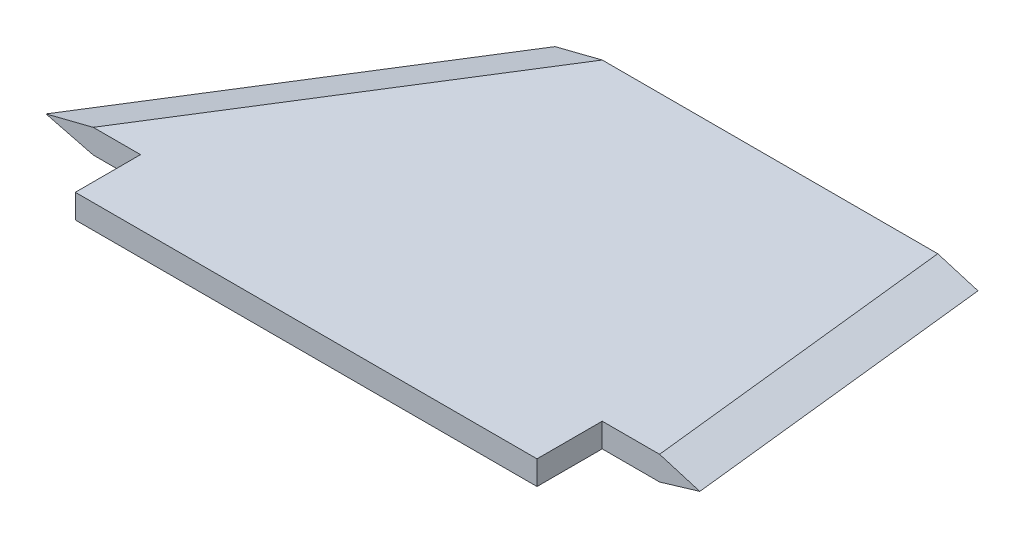
ISO-10303-21;
HEADER;
FILE_DESCRIPTION(('STEP AP214'),'2;1');
FILE_NAME('part.step','',(''),(''),'','','');
FILE_SCHEMA(('AUTOMOTIVE_DESIGN { 1 0 10303 214 1 1 1 1 }'));
ENDSEC;
DATA;
#1=APPLICATION_CONTEXT('core data for automotive mechanical design processes');
#2=APPLICATION_PROTOCOL_DEFINITION('international standard','automotive_design',2000,#1);
#3=PRODUCT_CONTEXT('',#1,'mechanical');
#4=PRODUCT('Part','Part','',(#3));
#5=PRODUCT_RELATED_PRODUCT_CATEGORY('part','',(#4));
#6=PRODUCT_DEFINITION_FORMATION('','',#4);
#7=PRODUCT_DEFINITION_CONTEXT('part definition',#1,'design');
#8=PRODUCT_DEFINITION('design','',#6,#7);
#9=PRODUCT_DEFINITION_SHAPE('','',#8);
#10=(LENGTH_UNIT() NAMED_UNIT(*) SI_UNIT(.MILLI.,.METRE.));
#11=(NAMED_UNIT(*) PLANE_ANGLE_UNIT() SI_UNIT($,.RADIAN.));
#12=(NAMED_UNIT(*) SI_UNIT($,.STERADIAN.) SOLID_ANGLE_UNIT());
#13=UNCERTAINTY_MEASURE_WITH_UNIT(LENGTH_MEASURE(1.E-05),#10,'distance_accuracy_value','');
#14=(GEOMETRIC_REPRESENTATION_CONTEXT(3) GLOBAL_UNCERTAINTY_ASSIGNED_CONTEXT((#13)) GLOBAL_UNIT_ASSIGNED_CONTEXT((#10,
#11,#12)) REPRESENTATION_CONTEXT('',''));
#15=CARTESIAN_POINT('',(0.,0.,0.));
#16=DIRECTION('',(0.,0.,1.));
#17=DIRECTION('',(1.,0.,0.));
#18=AXIS2_PLACEMENT_3D('',#15,#16,#17);
#19=CARTESIAN_POINT('',(0.,5.2832,0.));
#20=DIRECTION('',(0.,0.,-1.));
#21=DIRECTION('',(-1.,0.,0.));
#22=AXIS2_PLACEMENT_3D('',#19,#20,#21);
#23=PLANE('',#22);
#24=DIRECTION('',(-0.969192033309641,-0.246306318573284,0.));
#25=VECTOR('',#24,1.);
#26=CARTESIAN_POINT('',(11.0152498630052,4.27256849321468,0.));
#27=LINE('',#26,#25);
#28=CARTESIAN_POINT('',(14.9919891146075,5.2832,0.));
#29=VERTEX_POINT('',#28);
#30=CARTESIAN_POINT('',(4.59754332847974,2.64160000000002,0.));
#31=VERTEX_POINT('',#30);
#32=EDGE_CURVE('E159',#29,#31,#27,.T.);
#33=ORIENTED_EDGE('',*,*,#32,.T.);
#34=DIRECTION('',(-0.969192033309639,0.246306318573292,0.));
#35=VECTOR('',#34,1.);
#36=CARTESIAN_POINT('',(40.560407465065,-6.49784849565622,0.));
#37=LINE('',#36,#35);
#38=CARTESIAN_POINT('',(14.9919891146074,0.,0.));
#39=VERTEX_POINT('',#38);
#40=EDGE_CURVE('E167',#31,#39,#37,.F.);
#41=ORIENTED_EDGE('',*,*,#40,.T.);
#42=DIRECTION('',(1.,0.,0.));
#43=VECTOR('',#42,1.);
#44=CARTESIAN_POINT('',(0.,0.,0.));
#45=LINE('',#44,#43);
#46=CARTESIAN_POINT('',(25.4,0.,0.));
#47=VERTEX_POINT('',#46);
#48=EDGE_CURVE('E145',#39,#47,#45,.T.);
#49=ORIENTED_EDGE('',*,*,#48,.T.);
#50=DIRECTION('',(0.,-1.,0.));
#51=VECTOR('',#50,1.);
#52=CARTESIAN_POINT('',(25.4,5.2832,0.));
#53=LINE('',#52,#51);
#54=CARTESIAN_POINT('',(25.4,5.2832,0.));
#55=VERTEX_POINT('',#54);
#56=EDGE_CURVE('E136',#55,#47,#53,.T.);
#57=ORIENTED_EDGE('',*,*,#56,.F.);
#58=DIRECTION('',(1.,0.,0.));
#59=VECTOR('',#58,1.);
#60=CARTESIAN_POINT('',(0.,5.2832,0.));
#61=LINE('',#60,#59);
#62=EDGE_CURVE('E118',#29,#55,#61,.T.);
#63=ORIENTED_EDGE('',*,*,#62,.F.);
#64=EDGE_LOOP('',(#33,#41,#49,#57,#63));
#65=FACE_BOUND('',#64,.T.);
#66=ADVANCED_FACE('F41',(#65),#23,.F.);
#67=DIRECTION('',(-0.958305370272864,-0.285746071374897,0.));
#68=VECTOR('',#67,1.);
#69=CARTESIAN_POINT('',(152.4,3.80999999999999,0.));
#70=LINE('',#69,#68);
#71=CARTESIAN_POINT('',(139.622419390854,0.,0.));
#72=VERTEX_POINT('',#71);
#73=CARTESIAN_POINT('',(148.481541946528,2.64159999999997,0.));
#74=VERTEX_POINT('',#73);
#75=EDGE_CURVE('E194',#72,#74,#70,.F.);
#76=ORIENTED_EDGE('',*,*,#75,.T.);
#77=DIRECTION('',(-0.958305370272862,0.285746071374906,0.));
#78=VECTOR('',#77,1.);
#79=CARTESIAN_POINT('',(138.070114185651,5.74606405953799,0.));
#80=LINE('',#79,#78);
#81=CARTESIAN_POINT('',(139.622419390854,5.2832,0.));
#82=VERTEX_POINT('',#81);
#83=EDGE_CURVE('E11',#74,#82,#80,.T.);
#84=ORIENTED_EDGE('',*,*,#83,.T.);
#85=CARTESIAN_POINT('',(127.,5.2832,0.));
#86=VERTEX_POINT('',#85);
#87=EDGE_CURVE('E131',#86,#82,#61,.T.);
#88=ORIENTED_EDGE('',*,*,#87,.F.);
#89=DIRECTION('',(0.,-1.,0.));
#90=VECTOR('',#89,1.);
#91=CARTESIAN_POINT('',(127.,5.2832,0.));
#92=LINE('',#91,#90);
#93=CARTESIAN_POINT('',(127.,0.,0.));
#94=VERTEX_POINT('',#93);
#95=EDGE_CURVE('E242',#86,#94,#92,.T.);
#96=ORIENTED_EDGE('',*,*,#95,.T.);
#97=EDGE_CURVE('E148',#94,#72,#45,.T.);
#98=ORIENTED_EDGE('',*,*,#97,.T.);
#99=EDGE_LOOP('',(#76,#84,#88,#96,#98));
#100=FACE_BOUND('',#99,.T.);
#101=ADVANCED_FACE('F213',(#100),#23,.F.);
#102=CARTESIAN_POINT('',(144.78,5.2832,-68.834));
#103=DIRECTION('',(0.,0.,1.));
#104=DIRECTION('',(1.,0.,0.));
#105=AXIS2_PLACEMENT_3D('',#102,#103,#104);
#106=PLANE('',#105);
#107=DIRECTION('',(-1.,0.,0.));
#108=VECTOR('',#107,1.);
#109=CARTESIAN_POINT('',(144.78,5.2832,-68.834));
#110=LINE('',#109,#108);
#111=CARTESIAN_POINT('',(132.002419390854,5.2832,-68.834));
#112=VERTEX_POINT('',#111);
#113=CARTESIAN_POINT('',(58.1719891146075,5.2832,-68.834));
#114=VERTEX_POINT('',#113);
#115=EDGE_CURVE('E130',#112,#114,#110,.T.);
#116=ORIENTED_EDGE('',*,*,#115,.F.);
#117=DIRECTION('',(0.958305370272862,-0.285746071374906,0.));
#118=VECTOR('',#117,1.);
#119=CARTESIAN_POINT('',(137.447934957778,3.65946425967295,-68.834));
#120=LINE('',#119,#118);
#121=CARTESIAN_POINT('',(140.861541946528,2.64159999999997,-68.834));
#122=VERTEX_POINT('',#121);
#123=EDGE_CURVE('E65',#112,#122,#120,.T.);
#124=ORIENTED_EDGE('',*,*,#123,.T.);
#125=DIRECTION('',(0.958305370272864,0.285746071374897,0.));
#126=VECTOR('',#125,1.);
#127=CARTESIAN_POINT('',(151.777820772127,5.89659979986497,-68.834));
#128=LINE('',#127,#126);
#129=CARTESIAN_POINT('',(132.002419390854,0.,-68.834));
#130=VERTEX_POINT('',#129);
#131=EDGE_CURVE('E183',#122,#130,#128,.F.);
#132=ORIENTED_EDGE('',*,*,#131,.T.);
#133=DIRECTION('',(-1.,0.,0.));
#134=VECTOR('',#133,1.);
#135=CARTESIAN_POINT('',(144.78,0.,-68.834));
#136=LINE('',#135,#134);
#137=CARTESIAN_POINT('',(58.1719891146074,0.,-68.834));
#138=VERTEX_POINT('',#137);
#139=EDGE_CURVE('E162',#130,#138,#136,.T.);
#140=ORIENTED_EDGE('',*,*,#139,.T.);
#141=DIRECTION('',(0.969192033309639,-0.246306318573292,0.));
#142=VECTOR('',#141,1.);
#143=CARTESIAN_POINT('',(43.18,3.81000000000009,-68.834));
#144=LINE('',#143,#142);
#145=CARTESIAN_POINT('',(47.7775433284797,2.64160000000002,-68.834));
#146=VERTEX_POINT('',#145);
#147=EDGE_CURVE('E178',#138,#146,#144,.F.);
#148=ORIENTED_EDGE('',*,*,#147,.T.);
#149=DIRECTION('',(0.969192033309641,0.246306318573284,0.));
#150=VECTOR('',#149,1.);
#151=CARTESIAN_POINT('',(13.63484239794,-6.03528000244133,-68.834));
#152=LINE('',#151,#150);
#153=EDGE_CURVE('E174',#146,#114,#152,.T.);
#154=ORIENTED_EDGE('',*,*,#153,.T.);
#155=EDGE_LOOP('',(#116,#124,#132,#140,#148,#154));
#156=FACE_BOUND('',#155,.T.);
#157=ADVANCED_FACE('F223',(#156),#106,.F.);
#158=CARTESIAN_POINT('',(0.,5.2832,0.));
#159=DIRECTION('',(0.,1.,0.));
#160=DIRECTION('',(0.,0.,1.));
#161=AXIS2_PLACEMENT_3D('',#158,#159,#160);
#162=PLANE('',#161);
#163=ORIENTED_EDGE('',*,*,#87,.T.);
#164=DIRECTION('',(-0.110028971997583,0.,-0.993928380378162));
#165=VECTOR('',#164,1.);
#166=CARTESIAN_POINT('',(132.157109569197,5.2832,-67.4366320556307));
#167=LINE('',#166,#165);
#168=EDGE_CURVE('E197',#82,#112,#167,.T.);
#169=ORIENTED_EDGE('',*,*,#168,.T.);
#170=ORIENTED_EDGE('',*,*,#115,.T.);
#171=DIRECTION('',(-0.531403111821519,0.,0.847119078256656));
#172=VECTOR('',#171,1.);
#173=CARTESIAN_POINT('',(10.7584122938597,5.2832,6.74881952013337));
#174=LINE('',#173,#172);
#175=EDGE_CURVE('E125',#114,#29,#174,.T.);
#176=ORIENTED_EDGE('',*,*,#175,.T.);
#177=ORIENTED_EDGE('',*,*,#62,.T.);
#178=DIRECTION('',(0.,0.,1.));
#179=VECTOR('',#178,1.);
#180=CARTESIAN_POINT('',(25.4,5.2832,0.));
#181=LINE('',#180,#179);
#182=CARTESIAN_POINT('',(25.4,5.2832,14.351));
#183=VERTEX_POINT('',#182);
#184=EDGE_CURVE('E122',#55,#183,#181,.T.);
#185=ORIENTED_EDGE('',*,*,#184,.T.);
#186=DIRECTION('',(1.,0.,0.));
#187=VECTOR('',#186,1.);
#188=CARTESIAN_POINT('',(25.4,5.2832,14.351));
#189=LINE('',#188,#187);
#190=CARTESIAN_POINT('',(127.,5.2832,14.351));
#191=VERTEX_POINT('',#190);
#192=EDGE_CURVE('E141',#183,#191,#189,.T.);
#193=ORIENTED_EDGE('',*,*,#192,.T.);
#194=DIRECTION('',(0.,0.,-1.));
#195=VECTOR('',#194,1.);
#196=CARTESIAN_POINT('',(127.,5.2832,14.351));
#197=LINE('',#196,#195);
#198=EDGE_CURVE('E207',#191,#86,#197,.T.);
#199=ORIENTED_EDGE('',*,*,#198,.T.);
#200=EDGE_LOOP('',(#163,#169,#170,#176,#177,#185,#193,#199));
#201=FACE_BOUND('',#200,.T.);
#202=ADVANCED_FACE('F121',(#201),#162,.T.);
#203=CARTESIAN_POINT('',(0.,0.,0.));
#204=DIRECTION('',(0.,1.,0.));
#205=DIRECTION('',(0.,0.,1.));
#206=AXIS2_PLACEMENT_3D('',#203,#204,#205);
#207=PLANE('',#206);
#208=ORIENTED_EDGE('',*,*,#139,.F.);
#209=DIRECTION('',(0.110028971997583,0.,0.993928380378162));
#210=VECTOR('',#209,1.);
#211=CARTESIAN_POINT('',(137.932098068141,0.,-15.2692359485028));
#212=LINE('',#211,#210);
#213=EDGE_CURVE('E191',#130,#72,#212,.T.);
#214=ORIENTED_EDGE('',*,*,#213,.T.);
#215=ORIENTED_EDGE('',*,*,#97,.F.);
#216=DIRECTION('',(0.,0.,-1.));
#217=VECTOR('',#216,1.);
#218=CARTESIAN_POINT('',(127.,0.,14.351));
#219=LINE('',#218,#217);
#220=CARTESIAN_POINT('',(127.,0.,14.351));
#221=VERTEX_POINT('',#220);
#222=EDGE_CURVE('E142',#221,#94,#219,.T.);
#223=ORIENTED_EDGE('',*,*,#222,.F.);
#224=DIRECTION('',(1.,0.,0.));
#225=VECTOR('',#224,1.);
#226=CARTESIAN_POINT('',(25.4,0.,14.351));
#227=LINE('',#226,#225);
#228=CARTESIAN_POINT('',(25.4,0.,14.351));
#229=VERTEX_POINT('',#228);
#230=EDGE_CURVE('E232',#229,#221,#227,.T.);
#231=ORIENTED_EDGE('',*,*,#230,.F.);
#232=DIRECTION('',(0.,0.,1.));
#233=VECTOR('',#232,1.);
#234=CARTESIAN_POINT('',(25.4,0.,0.));
#235=LINE('',#234,#233);
#236=EDGE_CURVE('E188',#47,#229,#235,.T.);
#237=ORIENTED_EDGE('',*,*,#236,.F.);
#238=ORIENTED_EDGE('',*,*,#48,.F.);
#239=DIRECTION('',(0.531403111821519,0.,-0.847119078256656));
#240=VECTOR('',#239,1.);
#241=CARTESIAN_POINT('',(10.7584122938596,0.,6.7488195201333));
#242=LINE('',#241,#240);
#243=EDGE_CURVE('E170',#39,#138,#242,.T.);
#244=ORIENTED_EDGE('',*,*,#243,.T.);
#245=EDGE_LOOP('',(#208,#214,#215,#223,#231,#237,#238,#244));
#246=FACE_BOUND('',#245,.T.);
#247=ADVANCED_FACE('F219',(#246),#207,.F.);
#248=CARTESIAN_POINT('',(25.4,5.2832,0.));
#249=DIRECTION('',(1.,0.,0.));
#250=DIRECTION('',(0.,0.,-1.));
#251=AXIS2_PLACEMENT_3D('',#248,#249,#250);
#252=PLANE('',#251);
#253=ORIENTED_EDGE('',*,*,#236,.T.);
#254=DIRECTION('',(0.,-1.,0.));
#255=VECTOR('',#254,1.);
#256=CARTESIAN_POINT('',(25.4,5.2832,14.351));
#257=LINE('',#256,#255);
#258=EDGE_CURVE('E138',#183,#229,#257,.T.);
#259=ORIENTED_EDGE('',*,*,#258,.F.);
#260=ORIENTED_EDGE('',*,*,#184,.F.);
#261=ORIENTED_EDGE('',*,*,#56,.T.);
#262=EDGE_LOOP('',(#253,#259,#260,#261));
#263=FACE_BOUND('',#262,.T.);
#264=ADVANCED_FACE('F135',(#263),#252,.F.);
#265=CARTESIAN_POINT('',(25.4,5.2832,14.351));
#266=DIRECTION('',(0.,0.,-1.));
#267=DIRECTION('',(-1.,0.,0.));
#268=AXIS2_PLACEMENT_3D('',#265,#266,#267);
#269=PLANE('',#268);
#270=ORIENTED_EDGE('',*,*,#230,.T.);
#271=DIRECTION('',(0.,-1.,0.));
#272=VECTOR('',#271,1.);
#273=CARTESIAN_POINT('',(127.,5.2832,14.351));
#274=LINE('',#273,#272);
#275=EDGE_CURVE('E154',#191,#221,#274,.T.);
#276=ORIENTED_EDGE('',*,*,#275,.F.);
#277=ORIENTED_EDGE('',*,*,#192,.F.);
#278=ORIENTED_EDGE('',*,*,#258,.T.);
#279=EDGE_LOOP('',(#270,#276,#277,#278));
#280=FACE_BOUND('',#279,.T.);
#281=ADVANCED_FACE('F250',(#280),#269,.F.);
#282=CARTESIAN_POINT('',(127.,5.2832,14.351));
#283=DIRECTION('',(-1.,0.,0.));
#284=DIRECTION('',(0.,0.,1.));
#285=AXIS2_PLACEMENT_3D('',#282,#283,#284);
#286=PLANE('',#285);
#287=ORIENTED_EDGE('',*,*,#222,.T.);
#288=ORIENTED_EDGE('',*,*,#95,.F.);
#289=ORIENTED_EDGE('',*,*,#198,.F.);
#290=ORIENTED_EDGE('',*,*,#275,.T.);
#291=EDGE_LOOP('',(#287,#288,#289,#290));
#292=FACE_BOUND('',#291,.T.);
#293=ADVANCED_FACE('F248',(#292),#286,.F.);
#294=CARTESIAN_POINT('',(10.7584122938597,5.2832,6.74881952013336));
#295=DIRECTION('',(-0.243417875959959,0.957826285221152,-0.152697560565288));
#296=DIRECTION('',(0.531403111821519,0.,-0.847119078256656));
#297=AXIS2_PLACEMENT_3D('',#294,#295,#296);
#298=PLANE('',#297);
#299=ORIENTED_EDGE('',*,*,#175,.F.);
#300=ORIENTED_EDGE('',*,*,#153,.F.);
#301=DIRECTION('',(-0.531403111821519,0.,0.847119078256656));
#302=VECTOR('',#301,1.);
#303=CARTESIAN_POINT('',(46.4792464367837,2.64160000000002,-66.7643620138257));
#304=LINE('',#303,#302);
#305=EDGE_CURVE('E184',#31,#146,#304,.F.);
#306=ORIENTED_EDGE('',*,*,#305,.F.);
#307=ORIENTED_EDGE('',*,*,#32,.F.);
#308=EDGE_LOOP('',(#299,#300,#306,#307));
#309=FACE_BOUND('',#308,.T.);
#310=ADVANCED_FACE('F230',(#309),#298,.T.);
#311=CARTESIAN_POINT('',(43.18,3.81000000000009,-68.834));
#312=DIRECTION('',(0.243417875959966,0.95782628522115,0.152697560565293));
#313=DIRECTION('',(-0.531403111821519,0.,0.847119078256656));
#314=AXIS2_PLACEMENT_3D('',#311,#312,#313);
#315=PLANE('',#314);
#316=ORIENTED_EDGE('',*,*,#147,.F.);
#317=ORIENTED_EDGE('',*,*,#243,.F.);
#318=ORIENTED_EDGE('',*,*,#40,.F.);
#319=ORIENTED_EDGE('',*,*,#305,.T.);
#320=EDGE_LOOP('',(#316,#317,#318,#319));
#321=FACE_BOUND('',#320,.T.);
#322=ADVANCED_FACE('F226',(#321),#315,.F.);
#323=CARTESIAN_POINT('',(152.4,3.80999999999999,0.));
#324=DIRECTION('',(-0.285603218506044,0.957826285221152,0.0316165924545437));
#325=DIRECTION('',(-0.110028971997583,0.,-0.993928380378162));
#326=AXIS2_PLACEMENT_3D('',#323,#324,#325);
#327=PLANE('',#326);
#328=ORIENTED_EDGE('',*,*,#131,.F.);
#329=DIRECTION('',(-0.110028971997583,0.,-0.993928380378161));
#330=VECTOR('',#329,1.);
#331=CARTESIAN_POINT('',(148.528980267887,2.64159999999997,0.428526169606599));
#332=LINE('',#331,#330);
#333=EDGE_CURVE('E51',#122,#74,#332,.F.);
#334=ORIENTED_EDGE('',*,*,#333,.T.);
#335=ORIENTED_EDGE('',*,*,#75,.F.);
#336=ORIENTED_EDGE('',*,*,#213,.F.);
#337=EDGE_LOOP('',(#328,#334,#335,#336));
#338=FACE_BOUND('',#337,.T.);
#339=ADVANCED_FACE('F216',(#338),#327,.F.);
#340=CARTESIAN_POINT('',(137.932098068141,5.2832,-15.2692359485028));
#341=DIRECTION('',(0.285603218506053,0.95782628522115,-0.0316165924545446));
#342=DIRECTION('',(0.110028971997583,0.,0.993928380378162));
#343=AXIS2_PLACEMENT_3D('',#340,#341,#342);
#344=PLANE('',#343);
#345=ORIENTED_EDGE('',*,*,#83,.F.);
#346=ORIENTED_EDGE('',*,*,#333,.F.);
#347=ORIENTED_EDGE('',*,*,#123,.F.);
#348=ORIENTED_EDGE('',*,*,#168,.F.);
#349=EDGE_LOOP('',(#345,#346,#347,#348));
#350=FACE_BOUND('',#349,.T.);
#351=ADVANCED_FACE('F44',(#350),#344,.T.);
#352=CLOSED_SHELL('',(#66,#101,#157,#202,#247,#264,#281,#293,#310,#322,#339,#351));
#353=MANIFOLD_SOLID_BREP('B2',#352);
#354=ADVANCED_BREP_SHAPE_REPRESENTATION('',(#18,#353),#14);
#355=SHAPE_DEFINITION_REPRESENTATION(#9,#354);
ENDSEC;
END-ISO-10303-21;
